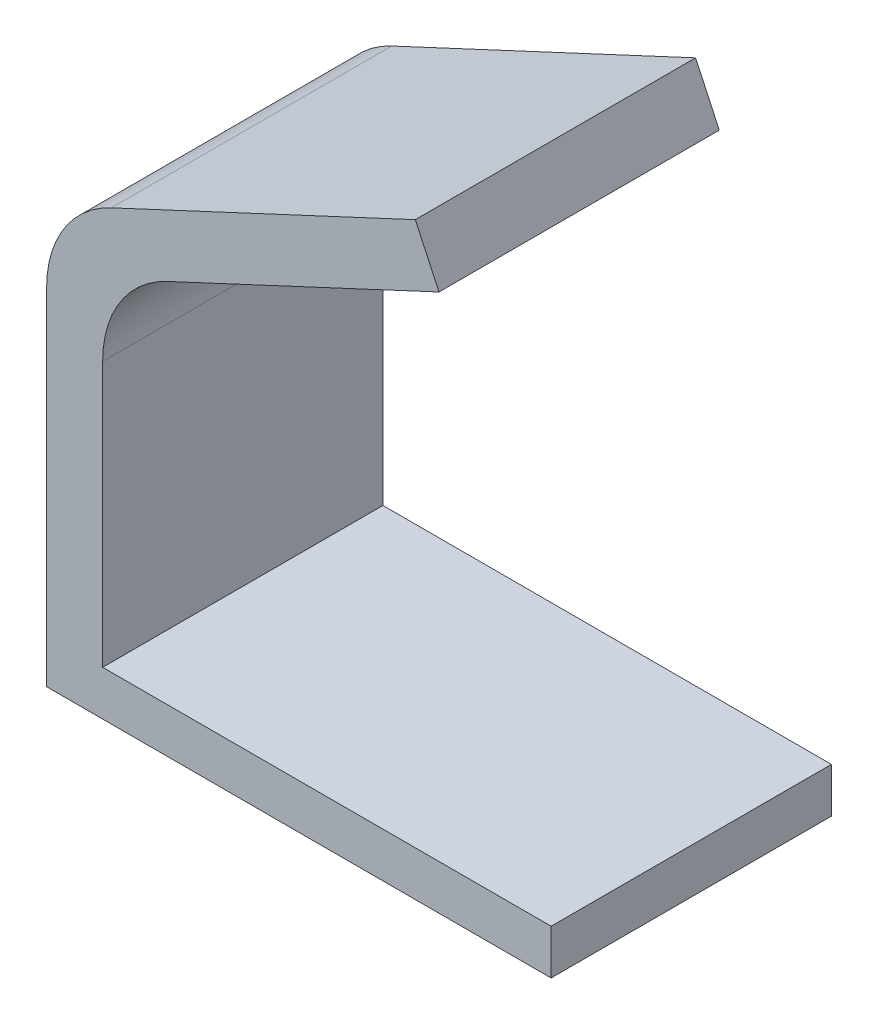
ISO-10303-21;
HEADER;
FILE_DESCRIPTION(('STEP AP214'),'2;1');
FILE_NAME('part.step','',(''),(''),'','','');
FILE_SCHEMA(('AUTOMOTIVE_DESIGN { 1 0 10303 214 1 1 1 1 }'));
ENDSEC;
DATA;
#1=APPLICATION_CONTEXT('core data for automotive mechanical design processes');
#2=APPLICATION_PROTOCOL_DEFINITION('international standard','automotive_design',2000,#1);
#3=PRODUCT_CONTEXT('',#1,'mechanical');
#4=PRODUCT('Part','Part','',(#3));
#5=PRODUCT_RELATED_PRODUCT_CATEGORY('part','',(#4));
#6=PRODUCT_DEFINITION_FORMATION('','',#4);
#7=PRODUCT_DEFINITION_CONTEXT('part definition',#1,'design');
#8=PRODUCT_DEFINITION('design','',#6,#7);
#9=PRODUCT_DEFINITION_SHAPE('','',#8);
#10=(LENGTH_UNIT() NAMED_UNIT(*) SI_UNIT(.MILLI.,.METRE.));
#11=(NAMED_UNIT(*) PLANE_ANGLE_UNIT() SI_UNIT($,.RADIAN.));
#12=(NAMED_UNIT(*) SI_UNIT($,.STERADIAN.) SOLID_ANGLE_UNIT());
#13=UNCERTAINTY_MEASURE_WITH_UNIT(LENGTH_MEASURE(1.E-05),#10,'distance_accuracy_value','');
#14=(GEOMETRIC_REPRESENTATION_CONTEXT(3) GLOBAL_UNCERTAINTY_ASSIGNED_CONTEXT((#13)) GLOBAL_UNIT_ASSIGNED_CONTEXT((#10,
#11,#12)) REPRESENTATION_CONTEXT('',''));
#15=CARTESIAN_POINT('',(0.,0.,0.));
#16=DIRECTION('',(0.,0.,1.));
#17=DIRECTION('',(1.,0.,0.));
#18=AXIS2_PLACEMENT_3D('',#15,#16,#17);
#19=CARTESIAN_POINT('',(-80.,8.,25.));
#20=DIRECTION('',(0.,-1.,0.));
#21=DIRECTION('',(0.,0.,-1.));
#22=AXIS2_PLACEMENT_3D('',#19,#20,#21);
#23=PLANE('',#22);
#24=DIRECTION('',(-1.,0.,0.));
#25=VECTOR('',#24,1.);
#26=CARTESIAN_POINT('',(-80.,8.,-25.));
#27=LINE('',#26,#25);
#28=CARTESIAN_POINT('',(0.,8.,-25.));
#29=VERTEX_POINT('',#28);
#30=CARTESIAN_POINT('',(-80.,8.,-25.));
#31=VERTEX_POINT('',#30);
#32=EDGE_CURVE('E135',#29,#31,#27,.T.);
#33=ORIENTED_EDGE('',*,*,#32,.T.);
#34=DIRECTION('',(0.,0.,-1.));
#35=VECTOR('',#34,1.);
#36=CARTESIAN_POINT('',(-80.,8.,25.));
#37=LINE('',#36,#35);
#38=CARTESIAN_POINT('',(-80.,8.,25.));
#39=VERTEX_POINT('',#38);
#40=EDGE_CURVE('E116',#39,#31,#37,.T.);
#41=ORIENTED_EDGE('',*,*,#40,.F.);
#42=DIRECTION('',(-1.,0.,0.));
#43=VECTOR('',#42,1.);
#44=CARTESIAN_POINT('',(-80.,8.,25.));
#45=LINE('',#44,#43);
#46=CARTESIAN_POINT('',(0.,8.,25.));
#47=VERTEX_POINT('',#46);
#48=EDGE_CURVE('E123',#47,#39,#45,.T.);
#49=ORIENTED_EDGE('',*,*,#48,.F.);
#50=DIRECTION('',(0.,0.,-1.));
#51=VECTOR('',#50,1.);
#52=CARTESIAN_POINT('',(0.,8.,25.));
#53=LINE('',#52,#51);
#54=EDGE_CURVE('E178',#47,#29,#53,.T.);
#55=ORIENTED_EDGE('',*,*,#54,.T.);
#56=EDGE_LOOP('',(#33,#41,#49,#55));
#57=FACE_BOUND('',#56,.T.);
#58=ADVANCED_FACE('F33',(#57),#23,.F.);
#59=CARTESIAN_POINT('',(-80.,68.,25.));
#60=DIRECTION('',(-1.,0.,0.));
#61=DIRECTION('',(0.,-1.,0.));
#62=AXIS2_PLACEMENT_3D('',#59,#60,#61);
#63=PLANE('',#62);
#64=DIRECTION('',(0.,1.,0.));
#65=VECTOR('',#64,1.);
#66=CARTESIAN_POINT('',(-80.,68.,-25.));
#67=LINE('',#66,#65);
#68=CARTESIAN_POINT('',(-80.,55.2585947838502,-25.));
#69=VERTEX_POINT('',#68);
#70=EDGE_CURVE('E155',#31,#69,#67,.T.);
#71=ORIENTED_EDGE('',*,*,#70,.T.);
#72=DIRECTION('',(0.,0.,-1.));
#73=VECTOR('',#72,1.);
#74=CARTESIAN_POINT('',(-80.,55.2585947838501,25.));
#75=LINE('',#74,#73);
#76=CARTESIAN_POINT('',(-80.,55.2585947838502,25.));
#77=VERTEX_POINT('',#76);
#78=EDGE_CURVE('E119',#69,#77,#75,.F.);
#79=ORIENTED_EDGE('',*,*,#78,.T.);
#80=DIRECTION('',(0.,1.,0.));
#81=VECTOR('',#80,1.);
#82=CARTESIAN_POINT('',(-80.,68.,25.));
#83=LINE('',#82,#81);
#84=EDGE_CURVE('E111',#39,#77,#83,.T.);
#85=ORIENTED_EDGE('',*,*,#84,.F.);
#86=ORIENTED_EDGE('',*,*,#40,.T.);
#87=EDGE_LOOP('',(#71,#79,#85,#86));
#88=FACE_BOUND('',#87,.T.);
#89=ADVANCED_FACE('F114',(#88),#63,.F.);
#90=CARTESIAN_POINT('',(-80.,68.,25.));
#91=DIRECTION('',(-0.422618261740701,0.906307787036649,0.));
#92=DIRECTION('',(-0.906307787036649,-0.422618261740701,0.));
#93=AXIS2_PLACEMENT_3D('',#90,#91,#92);
#94=PLANE('',#93);
#95=DIRECTION('',(0.906307787036649,0.422618261740701,0.));
#96=VECTOR('',#95,1.);
#97=CARTESIAN_POINT('',(-80.,68.,25.));
#98=LINE('',#97,#96);
#99=CARTESIAN_POINT('',(-68.452365234814,73.3847505245832,25.));
#100=VERTEX_POINT('',#99);
#101=CARTESIAN_POINT('',(-20.,95.9784594893,25.));
#102=VERTEX_POINT('',#101);
#103=EDGE_CURVE('E122',#100,#102,#98,.T.);
#104=ORIENTED_EDGE('',*,*,#103,.F.);
#105=DIRECTION('',(0.,0.,-1.));
#106=VECTOR('',#105,1.);
#107=CARTESIAN_POINT('',(-68.452365234814,73.3847505245832,-25.));
#108=LINE('',#107,#106);
#109=CARTESIAN_POINT('',(-68.452365234814,73.3847505245832,-25.));
#110=VERTEX_POINT('',#109);
#111=EDGE_CURVE('E136',#100,#110,#108,.T.);
#112=ORIENTED_EDGE('',*,*,#111,.T.);
#113=DIRECTION('',(0.906307787036649,0.422618261740701,0.));
#114=VECTOR('',#113,1.);
#115=CARTESIAN_POINT('',(-80.,68.,-25.));
#116=LINE('',#115,#114);
#117=CARTESIAN_POINT('',(-20.,95.9784594893,-25.));
#118=VERTEX_POINT('',#117);
#119=EDGE_CURVE('E157',#110,#118,#116,.T.);
#120=ORIENTED_EDGE('',*,*,#119,.T.);
#121=DIRECTION('',(0.,0.,-1.));
#122=VECTOR('',#121,1.);
#123=CARTESIAN_POINT('',(-20.,95.9784594893,25.));
#124=LINE('',#123,#122);
#125=EDGE_CURVE('E137',#102,#118,#124,.T.);
#126=ORIENTED_EDGE('',*,*,#125,.F.);
#127=EDGE_LOOP('',(#104,#112,#120,#126));
#128=FACE_BOUND('',#127,.T.);
#129=ADVANCED_FACE('F165',(#128),#94,.F.);
#130=CARTESIAN_POINT('',(-20.,95.9784594893,25.));
#131=DIRECTION('',(-0.906307787036649,-0.422618261740701,0.));
#132=DIRECTION('',(0.422618261740701,-0.906307787036649,0.));
#133=AXIS2_PLACEMENT_3D('',#130,#131,#132);
#134=PLANE('',#133);
#135=DIRECTION('',(-0.422618261740701,0.906307787036649,0.));
#136=VECTOR('',#135,1.);
#137=CARTESIAN_POINT('',(-20.,95.9784594893,-25.));
#138=LINE('',#137,#136);
#139=CARTESIAN_POINT('',(-24.226182617407,105.041537359667,-25.));
#140=VERTEX_POINT('',#139);
#141=EDGE_CURVE('E181',#118,#140,#138,.T.);
#142=ORIENTED_EDGE('',*,*,#141,.T.);
#143=DIRECTION('',(0.,0.,-1.));
#144=VECTOR('',#143,1.);
#145=CARTESIAN_POINT('',(-24.226182617407,105.041537359667,25.));
#146=LINE('',#145,#144);
#147=CARTESIAN_POINT('',(-24.226182617407,105.041537359667,25.));
#148=VERTEX_POINT('',#147);
#149=EDGE_CURVE('E142',#148,#140,#146,.T.);
#150=ORIENTED_EDGE('',*,*,#149,.F.);
#151=DIRECTION('',(-0.422618261740701,0.906307787036649,0.));
#152=VECTOR('',#151,1.);
#153=CARTESIAN_POINT('',(-20.,95.9784594893,25.));
#154=LINE('',#153,#152);
#155=EDGE_CURVE('E167',#102,#148,#154,.T.);
#156=ORIENTED_EDGE('',*,*,#155,.F.);
#157=ORIENTED_EDGE('',*,*,#125,.T.);
#158=EDGE_LOOP('',(#142,#150,#156,#157));
#159=FACE_BOUND('',#158,.T.);
#160=ADVANCED_FACE('F200',(#159),#134,.F.);
#161=CARTESIAN_POINT('',(-24.226182617407,105.041537359667,25.));
#162=DIRECTION('',(0.422618261740701,-0.906307787036649,0.));
#163=DIRECTION('',(0.906307787036649,0.422618261740701,0.));
#164=AXIS2_PLACEMENT_3D('',#161,#162,#163);
#165=PLANE('',#164);
#166=DIRECTION('',(-0.906307787036649,-0.422618261740701,0.));
#167=VECTOR('',#166,1.);
#168=CARTESIAN_POINT('',(-24.226182617407,105.041537359667,-25.));
#169=LINE('',#168,#167);
#170=CARTESIAN_POINT('',(-78.452365234814,79.755453132658,-25.));
#171=VERTEX_POINT('',#170);
#172=EDGE_CURVE('E183',#140,#171,#169,.T.);
#173=ORIENTED_EDGE('',*,*,#172,.T.);
#174=DIRECTION('',(0.,0.,-1.));
#175=VECTOR('',#174,1.);
#176=CARTESIAN_POINT('',(-78.452365234814,79.755453132658,25.));
#177=LINE('',#176,#175);
#178=CARTESIAN_POINT('',(-78.452365234814,79.755453132658,25.));
#179=VERTEX_POINT('',#178);
#180=EDGE_CURVE('E48',#171,#179,#177,.F.);
#181=ORIENTED_EDGE('',*,*,#180,.T.);
#182=DIRECTION('',(-0.906307787036649,-0.422618261740701,0.));
#183=VECTOR('',#182,1.);
#184=CARTESIAN_POINT('',(-24.226182617407,105.041537359667,25.));
#185=LINE('',#184,#183);
#186=EDGE_CURVE('E169',#148,#179,#185,.T.);
#187=ORIENTED_EDGE('',*,*,#186,.F.);
#188=ORIENTED_EDGE('',*,*,#149,.T.);
#189=EDGE_LOOP('',(#173,#181,#187,#188));
#190=FACE_BOUND('',#189,.T.);
#191=ADVANCED_FACE('F198',(#190),#165,.F.);
#192=CARTESIAN_POINT('',(-90.,0.,25.));
#193=DIRECTION('',(1.,0.,0.));
#194=DIRECTION('',(0.,0.,-1.));
#195=AXIS2_PLACEMENT_3D('',#192,#193,#194);
#196=PLANE('',#195);
#197=DIRECTION('',(0.,-1.,0.));
#198=VECTOR('',#197,1.);
#199=CARTESIAN_POINT('',(-90.,0.,25.));
#200=LINE('',#199,#198);
#201=CARTESIAN_POINT('',(-90.,61.6292973919251,25.));
#202=VERTEX_POINT('',#201);
#203=CARTESIAN_POINT('',(-90.,0.,25.));
#204=VERTEX_POINT('',#203);
#205=EDGE_CURVE('E173',#202,#204,#200,.T.);
#206=ORIENTED_EDGE('',*,*,#205,.F.);
#207=DIRECTION('',(0.,0.,-1.));
#208=VECTOR('',#207,1.);
#209=CARTESIAN_POINT('',(-90.,61.6292973919251,25.));
#210=LINE('',#209,#208);
#211=CARTESIAN_POINT('',(-90.,61.6292973919251,-25.));
#212=VERTEX_POINT('',#211);
#213=EDGE_CURVE('E147',#202,#212,#210,.T.);
#214=ORIENTED_EDGE('',*,*,#213,.T.);
#215=DIRECTION('',(0.,-1.,0.));
#216=VECTOR('',#215,1.);
#217=CARTESIAN_POINT('',(-90.,0.,-25.));
#218=LINE('',#217,#216);
#219=CARTESIAN_POINT('',(-90.,0.,-25.));
#220=VERTEX_POINT('',#219);
#221=EDGE_CURVE('E185',#212,#220,#218,.T.);
#222=ORIENTED_EDGE('',*,*,#221,.T.);
#223=DIRECTION('',(0.,0.,-1.));
#224=VECTOR('',#223,1.);
#225=CARTESIAN_POINT('',(-90.,0.,25.));
#226=LINE('',#225,#224);
#227=EDGE_CURVE('E194',#204,#220,#226,.T.);
#228=ORIENTED_EDGE('',*,*,#227,.F.);
#229=EDGE_LOOP('',(#206,#214,#222,#228));
#230=FACE_BOUND('',#229,.T.);
#231=ADVANCED_FACE('F206',(#230),#196,.F.);
#232=CARTESIAN_POINT('',(0.,0.,25.));
#233=DIRECTION('',(0.,1.,0.));
#234=DIRECTION('',(-1.,0.,0.));
#235=AXIS2_PLACEMENT_3D('',#232,#233,#234);
#236=PLANE('',#235);
#237=DIRECTION('',(1.,0.,0.));
#238=VECTOR('',#237,1.);
#239=CARTESIAN_POINT('',(0.,0.,-25.));
#240=LINE('',#239,#238);
#241=CARTESIAN_POINT('',(0.,0.,-25.));
#242=VERTEX_POINT('',#241);
#243=EDGE_CURVE('E187',#220,#242,#240,.T.);
#244=ORIENTED_EDGE('',*,*,#243,.T.);
#245=DIRECTION('',(0.,0.,-1.));
#246=VECTOR('',#245,1.);
#247=CARTESIAN_POINT('',(0.,0.,25.));
#248=LINE('',#247,#246);
#249=CARTESIAN_POINT('',(0.,0.,25.));
#250=VERTEX_POINT('',#249);
#251=EDGE_CURVE('E191',#250,#242,#248,.T.);
#252=ORIENTED_EDGE('',*,*,#251,.F.);
#253=DIRECTION('',(1.,0.,0.));
#254=VECTOR('',#253,1.);
#255=CARTESIAN_POINT('',(0.,0.,25.));
#256=LINE('',#255,#254);
#257=EDGE_CURVE('E175',#204,#250,#256,.T.);
#258=ORIENTED_EDGE('',*,*,#257,.F.);
#259=ORIENTED_EDGE('',*,*,#227,.T.);
#260=EDGE_LOOP('',(#244,#252,#258,#259));
#261=FACE_BOUND('',#260,.T.);
#262=ADVANCED_FACE('F212',(#261),#236,.F.);
#263=CARTESIAN_POINT('',(0.,8.,25.));
#264=DIRECTION('',(-1.,0.,0.));
#265=DIRECTION('',(0.,-1.,0.));
#266=AXIS2_PLACEMENT_3D('',#263,#264,#265);
#267=PLANE('',#266);
#268=DIRECTION('',(0.,1.,0.));
#269=VECTOR('',#268,1.);
#270=CARTESIAN_POINT('',(0.,8.,-25.));
#271=LINE('',#270,#269);
#272=EDGE_CURVE('E132',#242,#29,#271,.T.);
#273=ORIENTED_EDGE('',*,*,#272,.T.);
#274=ORIENTED_EDGE('',*,*,#54,.F.);
#275=DIRECTION('',(0.,1.,0.));
#276=VECTOR('',#275,1.);
#277=CARTESIAN_POINT('',(0.,8.,25.));
#278=LINE('',#277,#276);
#279=EDGE_CURVE('E128',#250,#47,#278,.T.);
#280=ORIENTED_EDGE('',*,*,#279,.F.);
#281=ORIENTED_EDGE('',*,*,#251,.T.);
#282=EDGE_LOOP('',(#273,#274,#280,#281));
#283=FACE_BOUND('',#282,.T.);
#284=ADVANCED_FACE('F215',(#283),#267,.F.);
#285=CARTESIAN_POINT('',(0.,0.,25.));
#286=DIRECTION('',(0.,0.,-1.));
#287=DIRECTION('',(-1.,0.,0.));
#288=AXIS2_PLACEMENT_3D('',#285,#286,#287);
#289=PLANE('',#288);
#290=ORIENTED_EDGE('',*,*,#186,.T.);
#291=CARTESIAN_POINT('',(-70.,61.6292973919251,25.));
#292=DIRECTION('',(0.,0.,-1.));
#293=DIRECTION('',(-1.,0.,0.));
#294=AXIS2_PLACEMENT_3D('',#291,#292,#293);
#295=CIRCLE('',#294,20.);
#296=EDGE_CURVE('E152',#179,#202,#295,.F.);
#297=ORIENTED_EDGE('',*,*,#296,.T.);
#298=ORIENTED_EDGE('',*,*,#205,.T.);
#299=ORIENTED_EDGE('',*,*,#257,.T.);
#300=ORIENTED_EDGE('',*,*,#279,.T.);
#301=ORIENTED_EDGE('',*,*,#48,.T.);
#302=ORIENTED_EDGE('',*,*,#84,.T.);
#303=CARTESIAN_POINT('',(-60.,55.2585947838502,25.));
#304=DIRECTION('',(0.,0.,-1.));
#305=DIRECTION('',(-1.,0.,0.));
#306=AXIS2_PLACEMENT_3D('',#303,#304,#305);
#307=CIRCLE('',#306,20.);
#308=EDGE_CURVE('E11',#77,#100,#307,.T.);
#309=ORIENTED_EDGE('',*,*,#308,.T.);
#310=ORIENTED_EDGE('',*,*,#103,.T.);
#311=ORIENTED_EDGE('',*,*,#155,.T.);
#312=EDGE_LOOP('',(#290,#297,#298,#299,#300,#301,#302,#309,#310,#311));
#313=FACE_BOUND('',#312,.T.);
#314=ADVANCED_FACE('F126',(#313),#289,.F.);
#315=CARTESIAN_POINT('',(0.,0.,-25.));
#316=DIRECTION('',(0.,0.,-1.));
#317=DIRECTION('',(-1.,0.,0.));
#318=AXIS2_PLACEMENT_3D('',#315,#316,#317);
#319=PLANE('',#318);
#320=ORIENTED_EDGE('',*,*,#221,.F.);
#321=CARTESIAN_POINT('',(-70.,61.6292973919251,-25.));
#322=DIRECTION('',(0.,0.,-1.));
#323=DIRECTION('',(-1.,0.,0.));
#324=AXIS2_PLACEMENT_3D('',#321,#322,#323);
#325=CIRCLE('',#324,20.);
#326=EDGE_CURVE('E56',#212,#171,#325,.T.);
#327=ORIENTED_EDGE('',*,*,#326,.T.);
#328=ORIENTED_EDGE('',*,*,#172,.F.);
#329=ORIENTED_EDGE('',*,*,#141,.F.);
#330=ORIENTED_EDGE('',*,*,#119,.F.);
#331=CARTESIAN_POINT('',(-60.,55.2585947838502,-25.));
#332=DIRECTION('',(0.,0.,-1.));
#333=DIRECTION('',(-1.,0.,0.));
#334=AXIS2_PLACEMENT_3D('',#331,#332,#333);
#335=CIRCLE('',#334,20.);
#336=EDGE_CURVE('E41',#110,#69,#335,.F.);
#337=ORIENTED_EDGE('',*,*,#336,.T.);
#338=ORIENTED_EDGE('',*,*,#70,.F.);
#339=ORIENTED_EDGE('',*,*,#32,.F.);
#340=ORIENTED_EDGE('',*,*,#272,.F.);
#341=ORIENTED_EDGE('',*,*,#243,.F.);
#342=EDGE_LOOP('',(#320,#327,#328,#329,#330,#337,#338,#339,#340,#341));
#343=FACE_BOUND('',#342,.T.);
#344=ADVANCED_FACE('F154',(#343),#319,.T.);
#345=CARTESIAN_POINT('',(-60.,55.2585947838502,25.));
#346=DIRECTION('',(0.,0.,1.));
#347=DIRECTION('',(1.,0.,0.));
#348=AXIS2_PLACEMENT_3D('',#345,#346,#347);
#349=CYLINDRICAL_SURFACE('',#348,20.);
#350=ORIENTED_EDGE('',*,*,#308,.F.);
#351=ORIENTED_EDGE('',*,*,#78,.F.);
#352=ORIENTED_EDGE('',*,*,#336,.F.);
#353=ORIENTED_EDGE('',*,*,#111,.F.);
#354=EDGE_LOOP('',(#350,#351,#352,#353));
#355=FACE_BOUND('',#354,.T.);
#356=ADVANCED_FACE('F161',(#355),#349,.F.);
#357=CARTESIAN_POINT('',(-70.,61.6292973919251,25.));
#358=DIRECTION('',(0.,0.,-1.));
#359=DIRECTION('',(-1.,0.,0.));
#360=AXIS2_PLACEMENT_3D('',#357,#358,#359);
#361=CYLINDRICAL_SURFACE('',#360,20.);
#362=ORIENTED_EDGE('',*,*,#296,.F.);
#363=ORIENTED_EDGE('',*,*,#180,.F.);
#364=ORIENTED_EDGE('',*,*,#326,.F.);
#365=ORIENTED_EDGE('',*,*,#213,.F.);
#366=EDGE_LOOP('',(#362,#363,#364,#365));
#367=FACE_BOUND('',#366,.T.);
#368=ADVANCED_FACE('F35',(#367),#361,.T.);
#369=CLOSED_SHELL('',(#58,#89,#129,#160,#191,#231,#262,#284,#314,#344,#356,#368));
#370=MANIFOLD_SOLID_BREP('B2',#369);
#371=ADVANCED_BREP_SHAPE_REPRESENTATION('',(#18,#370),#14);
#372=SHAPE_DEFINITION_REPRESENTATION(#9,#371);
ENDSEC;
END-ISO-10303-21;
